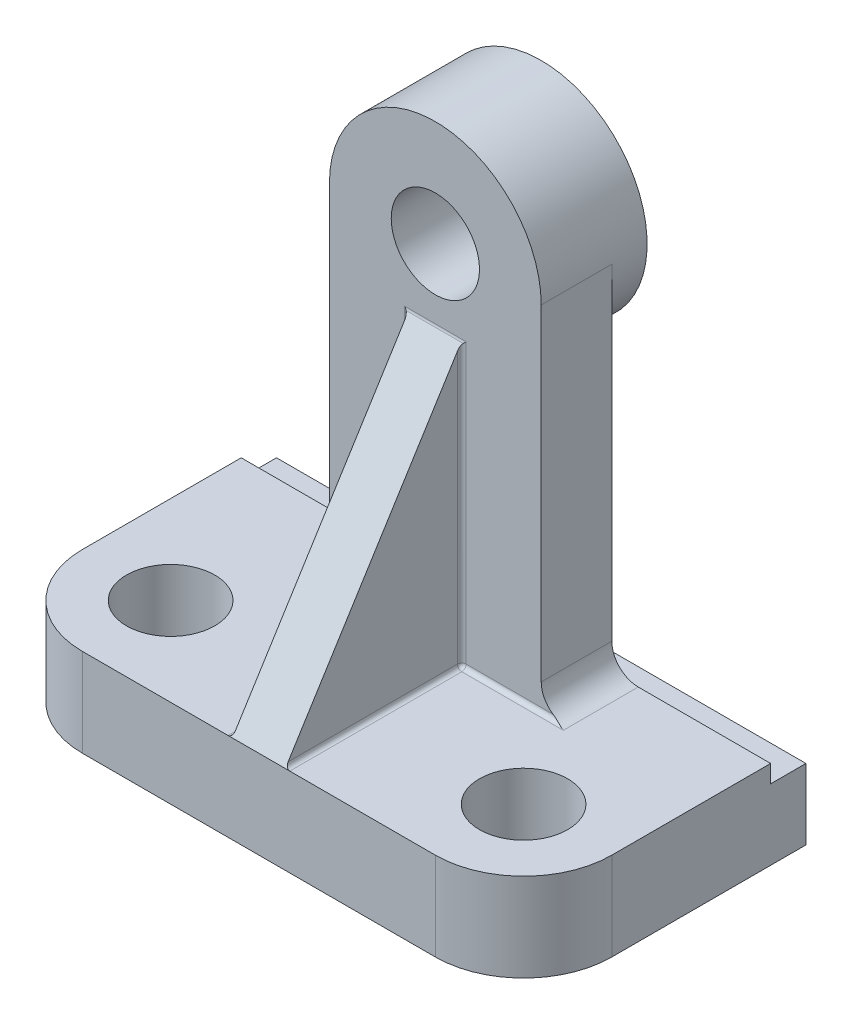
ISO-10303-21;
HEADER;
FILE_DESCRIPTION(('STEP AP214'),'2;1');
FILE_NAME('part.step','',(''),(''),'','','');
FILE_SCHEMA(('AUTOMOTIVE_DESIGN { 1 0 10303 214 1 1 1 1 }'));
ENDSEC;
DATA;
#1=APPLICATION_CONTEXT('core data for automotive mechanical design processes');
#2=APPLICATION_PROTOCOL_DEFINITION('international standard','automotive_design',2000,#1);
#3=PRODUCT_CONTEXT('',#1,'mechanical');
#4=PRODUCT('Part','Part','',(#3));
#5=PRODUCT_RELATED_PRODUCT_CATEGORY('part','',(#4));
#6=PRODUCT_DEFINITION_FORMATION('','',#4);
#7=PRODUCT_DEFINITION_CONTEXT('part definition',#1,'design');
#8=PRODUCT_DEFINITION('design','',#6,#7);
#9=PRODUCT_DEFINITION_SHAPE('','',#8);
#10=(LENGTH_UNIT() NAMED_UNIT(*) SI_UNIT(.MILLI.,.METRE.));
#11=(NAMED_UNIT(*) PLANE_ANGLE_UNIT() SI_UNIT($,.RADIAN.));
#12=(NAMED_UNIT(*) SI_UNIT($,.STERADIAN.) SOLID_ANGLE_UNIT());
#13=UNCERTAINTY_MEASURE_WITH_UNIT(LENGTH_MEASURE(1.E-05),#10,'distance_accuracy_value','');
#14=(GEOMETRIC_REPRESENTATION_CONTEXT(3) GLOBAL_UNCERTAINTY_ASSIGNED_CONTEXT((#13)) GLOBAL_UNIT_ASSIGNED_CONTEXT((#10,
#11,#12)) REPRESENTATION_CONTEXT('',''));
#15=CARTESIAN_POINT('',(0.,0.,0.));
#16=DIRECTION('',(0.,0.,1.));
#17=DIRECTION('',(1.,0.,0.));
#18=AXIS2_PLACEMENT_3D('',#15,#16,#17);
#19=CARTESIAN_POINT('',(-64.708154954579,20.,-20.));
#20=DIRECTION('',(0.,-1.,0.));
#21=DIRECTION('',(0.,0.,-1.));
#22=AXIS2_PLACEMENT_3D('',#19,#20,#21);
#23=PLANE('',#22);
#24=CARTESIAN_POINT('',(15.291845045421,20.,-20.));
#25=DIRECTION('',(0.,1.,0.));
#26=DIRECTION('',(0.,0.,1.));
#27=AXIS2_PLACEMENT_3D('',#24,#25,#26);
#28=CIRCLE('',#27,10.);
#29=CARTESIAN_POINT('',(15.291845045421,20.,-10.));
#30=VERTEX_POINT('',#29);
#31=EDGE_CURVE('E303',#30,#30,#28,.T.);
#32=ORIENTED_EDGE('',*,*,#31,.F.);
#33=EDGE_LOOP('',(#32));
#34=FACE_BOUND('',#33,.T.);
#35=DIRECTION('',(0.,0.,-1.));
#36=VECTOR('',#35,1.);
#37=CARTESIAN_POINT('',(5.29184504542103,20.,-40.));
#38=LINE('',#37,#36);
#39=CARTESIAN_POINT('',(5.29184504542103,20.,-39.));
#40=VERTEX_POINT('',#39);
#41=CARTESIAN_POINT('',(5.291845045421,20.,-56.));
#42=VERTEX_POINT('',#41);
#43=EDGE_CURVE('E263',#40,#42,#38,.T.);
#44=ORIENTED_EDGE('',*,*,#43,.F.);
#45=DIRECTION('',(-1.,0.,0.));
#46=VECTOR('',#45,1.);
#47=CARTESIAN_POINT('',(-64.708154954579,20.,-39.));
#48=LINE('',#47,#46);
#49=CARTESIAN_POINT('',(-17.708154954579,20.,-39.));
#50=VERTEX_POINT('',#49);
#51=EDGE_CURVE('E405',#40,#50,#48,.T.);
#52=ORIENTED_EDGE('',*,*,#51,.T.);
#53=DIRECTION('',(0.,0.,-1.));
#54=VECTOR('',#53,1.);
#55=CARTESIAN_POINT('',(-17.708154954579,20.,0.));
#56=LINE('',#55,#54);
#57=CARTESIAN_POINT('',(-17.7081549545789,20.,0.));
#58=VERTEX_POINT('',#57);
#59=EDGE_CURVE('E401',#50,#58,#56,.F.);
#60=ORIENTED_EDGE('',*,*,#59,.T.);
#61=DIRECTION('',(1.,0.,0.));
#62=VECTOR('',#61,1.);
#63=CARTESIAN_POINT('',(-64.708154954579,20.,0.));
#64=LINE('',#63,#62);
#65=CARTESIAN_POINT('',(15.291845045421,20.,0.));
#66=VERTEX_POINT('',#65);
#67=EDGE_CURVE('E323',#58,#66,#64,.T.);
#68=ORIENTED_EDGE('',*,*,#67,.T.);
#69=CARTESIAN_POINT('',(15.291845045421,20.,-20.));
#70=DIRECTION('',(0.,1.,0.));
#71=DIRECTION('',(0.,0.,1.));
#72=AXIS2_PLACEMENT_3D('',#69,#70,#71);
#73=CIRCLE('',#72,20.);
#74=CARTESIAN_POINT('',(35.291845045421,20.,-20.));
#75=VERTEX_POINT('',#74);
#76=EDGE_CURVE('E328',#66,#75,#73,.T.);
#77=ORIENTED_EDGE('',*,*,#76,.T.);
#78=DIRECTION('',(0.,0.,-1.));
#79=VECTOR('',#78,1.);
#80=CARTESIAN_POINT('',(35.291845045421,20.,-20.));
#81=LINE('',#80,#79);
#82=CARTESIAN_POINT('',(35.291845045421,20.,-56.));
#83=VERTEX_POINT('',#82);
#84=EDGE_CURVE('E331',#75,#83,#81,.T.);
#85=ORIENTED_EDGE('',*,*,#84,.T.);
#86=DIRECTION('',(1.,0.,0.));
#87=VECTOR('',#86,1.);
#88=CARTESIAN_POINT('',(-84.708154954579,20.,-56.));
#89=LINE('',#88,#87);
#90=EDGE_CURVE('E267',#42,#83,#89,.T.);
#91=ORIENTED_EDGE('',*,*,#90,.F.);
#92=EDGE_LOOP('',(#44,#52,#60,#68,#77,#85,#91));
#93=FACE_BOUND('',#92,.T.);
#94=ADVANCED_FACE('F43',(#34,#93),#23,.F.);
#95=CARTESIAN_POINT('',(-84.708154954579,16.,-56.));
#96=DIRECTION('',(0.,0.,1.));
#97=DIRECTION('',(1.,0.,0.));
#98=AXIS2_PLACEMENT_3D('',#95,#96,#97);
#99=PLANE('',#98);
#100=DIRECTION('',(0.,1.,0.));
#101=VECTOR('',#100,1.);
#102=CARTESIAN_POINT('',(-48.708154954579,26.,-56.));
#103=LINE('',#102,#101);
#104=CARTESIAN_POINT('',(-48.708154954579,26.,-56.));
#105=VERTEX_POINT('',#104);
#106=CARTESIAN_POINT('',(-48.708154954579,100.,-56.));
#107=VERTEX_POINT('',#106);
#108=EDGE_CURVE('E208',#105,#107,#103,.T.);
#109=ORIENTED_EDGE('',*,*,#108,.T.);
#110=CARTESIAN_POINT('',(-24.708154954579,100.,-56.));
#111=DIRECTION('',(0.,0.,-1.));
#112=DIRECTION('',(-1.,0.,0.));
#113=AXIS2_PLACEMENT_3D('',#110,#111,#112);
#114=CIRCLE('',#113,24.);
#115=CARTESIAN_POINT('',(-0.708154954578957,100.,-56.));
#116=VERTEX_POINT('',#115);
#117=EDGE_CURVE('E213',#116,#107,#114,.T.);
#118=ORIENTED_EDGE('',*,*,#117,.F.);
#119=DIRECTION('',(0.,-1.,0.));
#120=VECTOR('',#119,1.);
#121=CARTESIAN_POINT('',(-0.70815495457896,100.,-56.));
#122=LINE('',#121,#120);
#123=CARTESIAN_POINT('',(-0.70815495457897,26.,-56.));
#124=VERTEX_POINT('',#123);
#125=EDGE_CURVE('E196',#116,#124,#122,.T.);
#126=ORIENTED_EDGE('',*,*,#125,.T.);
#127=CARTESIAN_POINT('',(5.29184504542103,26.,-56.));
#128=DIRECTION('',(0.,0.,1.));
#129=DIRECTION('',(1.,0.,0.));
#130=AXIS2_PLACEMENT_3D('',#127,#128,#129);
#131=CIRCLE('',#130,6.);
#132=EDGE_CURVE('E207',#124,#42,#131,.T.);
#133=ORIENTED_EDGE('',*,*,#132,.T.);
#134=ORIENTED_EDGE('',*,*,#90,.T.);
#135=DIRECTION('',(0.,1.,0.));
#136=VECTOR('',#135,1.);
#137=CARTESIAN_POINT('',(35.291845045421,16.,-56.));
#138=LINE('',#137,#136);
#139=CARTESIAN_POINT('',(35.291845045421,16.,-56.));
#140=VERTEX_POINT('',#139);
#141=EDGE_CURVE('E296',#140,#83,#138,.T.);
#142=ORIENTED_EDGE('',*,*,#141,.F.);
#143=DIRECTION('',(1.,0.,0.));
#144=VECTOR('',#143,1.);
#145=CARTESIAN_POINT('',(-84.708154954579,16.,-56.));
#146=LINE('',#145,#144);
#147=CARTESIAN_POINT('',(-84.708154954579,16.,-56.));
#148=VERTEX_POINT('',#147);
#149=EDGE_CURVE('E282',#148,#140,#146,.T.);
#150=ORIENTED_EDGE('',*,*,#149,.F.);
#151=DIRECTION('',(0.,1.,0.));
#152=VECTOR('',#151,1.);
#153=CARTESIAN_POINT('',(-84.708154954579,16.,-56.));
#154=LINE('',#153,#152);
#155=CARTESIAN_POINT('',(-84.708154954579,20.,-56.));
#156=VERTEX_POINT('',#155);
#157=EDGE_CURVE('E292',#148,#156,#154,.T.);
#158=ORIENTED_EDGE('',*,*,#157,.T.);
#159=CARTESIAN_POINT('',(-54.708154954579,20.,-56.));
#160=VERTEX_POINT('',#159);
#161=EDGE_CURVE('E283',#156,#160,#89,.T.);
#162=ORIENTED_EDGE('',*,*,#161,.T.);
#163=CARTESIAN_POINT('',(-54.708154954579,26.,-56.));
#164=DIRECTION('',(0.,0.,1.));
#165=DIRECTION('',(1.,0.,0.));
#166=AXIS2_PLACEMENT_3D('',#163,#164,#165);
#167=CIRCLE('',#166,6.);
#168=EDGE_CURVE('E239',#160,#105,#167,.T.);
#169=ORIENTED_EDGE('',*,*,#168,.T.);
#170=EDGE_LOOP('',(#109,#118,#126,#133,#134,#142,#150,#158,#162,#169));
#171=FACE_BOUND('',#170,.T.);
#172=ADVANCED_FACE('F221',(#171),#99,.F.);
#173=CARTESIAN_POINT('',(-84.708154954579,20.,-64.));
#174=DIRECTION('',(0.,0.,1.));
#175=DIRECTION('',(1.,0.,0.));
#176=AXIS2_PLACEMENT_3D('',#173,#174,#175);
#177=PLANE('',#176);
#178=DIRECTION('',(0.,-1.,0.));
#179=VECTOR('',#178,1.);
#180=CARTESIAN_POINT('',(-84.708154954579,20.,-64.));
#181=LINE('',#180,#179);
#182=CARTESIAN_POINT('',(-84.708154954579,16.,-64.));
#183=VERTEX_POINT('',#182);
#184=CARTESIAN_POINT('',(-84.708154954579,0.,-64.));
#185=VERTEX_POINT('',#184);
#186=EDGE_CURVE('E360',#183,#185,#181,.T.);
#187=ORIENTED_EDGE('',*,*,#186,.F.);
#188=DIRECTION('',(-1.,0.,0.));
#189=VECTOR('',#188,1.);
#190=CARTESIAN_POINT('',(-84.708154954579,16.,-64.));
#191=LINE('',#190,#189);
#192=CARTESIAN_POINT('',(35.291845045421,16.,-64.));
#193=VERTEX_POINT('',#192);
#194=EDGE_CURVE('E289',#193,#183,#191,.T.);
#195=ORIENTED_EDGE('',*,*,#194,.F.);
#196=DIRECTION('',(0.,-1.,0.));
#197=VECTOR('',#196,1.);
#198=CARTESIAN_POINT('',(35.291845045421,20.,-64.));
#199=LINE('',#198,#197);
#200=CARTESIAN_POINT('',(35.291845045421,0.,-64.));
#201=VERTEX_POINT('',#200);
#202=EDGE_CURVE('E364',#193,#201,#199,.T.);
#203=ORIENTED_EDGE('',*,*,#202,.T.);
#204=DIRECTION('',(-1.,0.,0.));
#205=VECTOR('',#204,1.);
#206=CARTESIAN_POINT('',(-84.708154954579,0.,-64.));
#207=LINE('',#206,#205);
#208=EDGE_CURVE('E352',#201,#185,#207,.T.);
#209=ORIENTED_EDGE('',*,*,#208,.T.);
#210=EDGE_LOOP('',(#187,#195,#203,#209));
#211=FACE_BOUND('',#210,.T.);
#212=ADVANCED_FACE('F490',(#211),#177,.F.);
#213=DIRECTION('',(-1.,0.,0.));
#214=VECTOR('',#213,1.);
#215=CARTESIAN_POINT('',(-64.708154954579,20.,-39.));
#216=LINE('',#215,#214);
#217=CARTESIAN_POINT('',(-31.708154954579,20.,-39.));
#218=VERTEX_POINT('',#217);
#219=CARTESIAN_POINT('',(-54.708154954579,20.,-39.));
#220=VERTEX_POINT('',#219);
#221=EDGE_CURVE('E382',#218,#220,#216,.T.);
#222=ORIENTED_EDGE('',*,*,#221,.T.);
#223=DIRECTION('',(0.,0.,-1.));
#224=VECTOR('',#223,1.);
#225=CARTESIAN_POINT('',(-54.708154954579,20.,-40.));
#226=LINE('',#225,#224);
#227=EDGE_CURVE('E256',#220,#160,#226,.T.);
#228=ORIENTED_EDGE('',*,*,#227,.T.);
#229=ORIENTED_EDGE('',*,*,#161,.F.);
#230=DIRECTION('',(0.,0.,1.));
#231=VECTOR('',#230,1.);
#232=CARTESIAN_POINT('',(-84.708154954579,20.,-20.0000000000001));
#233=LINE('',#232,#231);
#234=CARTESIAN_POINT('',(-84.708154954579,20.,-20.0000000000001));
#235=VERTEX_POINT('',#234);
#236=EDGE_CURVE('E335',#156,#235,#233,.T.);
#237=ORIENTED_EDGE('',*,*,#236,.T.);
#238=CARTESIAN_POINT('',(-64.708154954579,20.,-20.));
#239=DIRECTION('',(0.,1.,0.));
#240=DIRECTION('',(0.,0.,-1.));
#241=AXIS2_PLACEMENT_3D('',#238,#239,#240);
#242=CIRCLE('',#241,20.);
#243=CARTESIAN_POINT('',(-64.708154954579,20.,0.));
#244=VERTEX_POINT('',#243);
#245=EDGE_CURVE('E319',#235,#244,#242,.T.);
#246=ORIENTED_EDGE('',*,*,#245,.T.);
#247=CARTESIAN_POINT('',(-31.708154954579,20.,0.));
#248=VERTEX_POINT('',#247);
#249=EDGE_CURVE('E325',#244,#248,#64,.T.);
#250=ORIENTED_EDGE('',*,*,#249,.T.);
#251=DIRECTION('',(0.,0.,-1.));
#252=VECTOR('',#251,1.);
#253=CARTESIAN_POINT('',(-31.708154954579,20.,-20.));
#254=LINE('',#253,#252);
#255=EDGE_CURVE('E379',#248,#218,#254,.T.);
#256=ORIENTED_EDGE('',*,*,#255,.T.);
#257=EDGE_LOOP('',(#222,#228,#229,#237,#246,#250,#256));
#258=FACE_BOUND('',#257,.T.);
#259=CARTESIAN_POINT('',(-64.708154954579,20.,-20.));
#260=DIRECTION('',(0.,1.,0.));
#261=DIRECTION('',(0.,0.,1.));
#262=AXIS2_PLACEMENT_3D('',#259,#260,#261);
#263=CIRCLE('',#262,10.);
#264=CARTESIAN_POINT('',(-64.708154954579,20.,-10.));
#265=VERTEX_POINT('',#264);
#266=EDGE_CURVE('E311',#265,#265,#263,.T.);
#267=ORIENTED_EDGE('',*,*,#266,.F.);
#268=EDGE_LOOP('',(#267));
#269=FACE_BOUND('',#268,.T.);
#270=ADVANCED_FACE('F486',(#258,#269),#23,.F.);
#271=CARTESIAN_POINT('',(-64.708154954579,0.,-20.));
#272=DIRECTION('',(0.,-1.,0.));
#273=DIRECTION('',(0.,0.,-1.));
#274=AXIS2_PLACEMENT_3D('',#271,#272,#273);
#275=PLANE('',#274);
#276=DIRECTION('',(0.,0.,1.));
#277=VECTOR('',#276,1.);
#278=CARTESIAN_POINT('',(-84.708154954579,0.,-20.0000000000001));
#279=LINE('',#278,#277);
#280=CARTESIAN_POINT('',(-84.708154954579,0.,-20.0000000000001));
#281=VERTEX_POINT('',#280);
#282=EDGE_CURVE('E324',#185,#281,#279,.T.);
#283=ORIENTED_EDGE('',*,*,#282,.F.);
#284=ORIENTED_EDGE('',*,*,#208,.F.);
#285=DIRECTION('',(0.,0.,-1.));
#286=VECTOR('',#285,1.);
#287=CARTESIAN_POINT('',(35.291845045421,0.,-20.));
#288=LINE('',#287,#286);
#289=CARTESIAN_POINT('',(35.291845045421,0.,-20.));
#290=VERTEX_POINT('',#289);
#291=EDGE_CURVE('E348',#290,#201,#288,.T.);
#292=ORIENTED_EDGE('',*,*,#291,.F.);
#293=CARTESIAN_POINT('',(15.291845045421,0.,-20.));
#294=DIRECTION('',(0.,1.,0.));
#295=DIRECTION('',(0.,0.,1.));
#296=AXIS2_PLACEMENT_3D('',#293,#294,#295);
#297=CIRCLE('',#296,20.);
#298=CARTESIAN_POINT('',(15.291845045421,0.,0.));
#299=VERTEX_POINT('',#298);
#300=EDGE_CURVE('E345',#299,#290,#297,.T.);
#301=ORIENTED_EDGE('',*,*,#300,.F.);
#302=DIRECTION('',(1.,0.,0.));
#303=VECTOR('',#302,1.);
#304=CARTESIAN_POINT('',(-64.708154954579,0.,0.));
#305=LINE('',#304,#303);
#306=CARTESIAN_POINT('',(-64.708154954579,0.,0.));
#307=VERTEX_POINT('',#306);
#308=EDGE_CURVE('E342',#307,#299,#305,.T.);
#309=ORIENTED_EDGE('',*,*,#308,.F.);
#310=CARTESIAN_POINT('',(-64.708154954579,0.,-20.));
#311=DIRECTION('',(0.,1.,0.));
#312=DIRECTION('',(0.,0.,-1.));
#313=AXIS2_PLACEMENT_3D('',#310,#311,#312);
#314=CIRCLE('',#313,20.);
#315=EDGE_CURVE('E315',#281,#307,#314,.T.);
#316=ORIENTED_EDGE('',*,*,#315,.F.);
#317=EDGE_LOOP('',(#283,#284,#292,#301,#309,#316));
#318=FACE_BOUND('',#317,.T.);
#319=CARTESIAN_POINT('',(-64.708154954579,0.,-20.));
#320=DIRECTION('',(0.,1.,0.));
#321=DIRECTION('',(0.,0.,1.));
#322=AXIS2_PLACEMENT_3D('',#319,#320,#321);
#323=CIRCLE('',#322,10.);
#324=CARTESIAN_POINT('',(-64.708154954579,0.,-10.));
#325=VERTEX_POINT('',#324);
#326=EDGE_CURVE('E307',#325,#325,#323,.T.);
#327=ORIENTED_EDGE('',*,*,#326,.T.);
#328=EDGE_LOOP('',(#327));
#329=FACE_BOUND('',#328,.T.);
#330=CARTESIAN_POINT('',(15.291845045421,0.,-20.));
#331=DIRECTION('',(0.,1.,0.));
#332=DIRECTION('',(0.,0.,1.));
#333=AXIS2_PLACEMENT_3D('',#330,#331,#332);
#334=CIRCLE('',#333,10.);
#335=CARTESIAN_POINT('',(15.291845045421,0.,-10.));
#336=VERTEX_POINT('',#335);
#337=EDGE_CURVE('E300',#336,#336,#334,.T.);
#338=ORIENTED_EDGE('',*,*,#337,.T.);
#339=EDGE_LOOP('',(#338));
#340=FACE_BOUND('',#339,.T.);
#341=ADVANCED_FACE('F497',(#318,#329,#340),#275,.T.);
#342=CARTESIAN_POINT('',(-64.708154954579,20.,-20.));
#343=DIRECTION('',(0.,-1.,0.));
#344=DIRECTION('',(0.,0.,-1.));
#345=AXIS2_PLACEMENT_3D('',#342,#343,#344);
#346=CYLINDRICAL_SURFACE('',#345,20.);
#347=ORIENTED_EDGE('',*,*,#315,.T.);
#348=DIRECTION('',(0.,-1.,0.));
#349=VECTOR('',#348,1.);
#350=CARTESIAN_POINT('',(-64.708154954579,20.,0.));
#351=LINE('',#350,#349);
#352=EDGE_CURVE('E375',#244,#307,#351,.T.);
#353=ORIENTED_EDGE('',*,*,#352,.F.);
#354=ORIENTED_EDGE('',*,*,#245,.F.);
#355=DIRECTION('',(0.,-1.,0.));
#356=VECTOR('',#355,1.);
#357=CARTESIAN_POINT('',(-84.708154954579,20.,-20.0000000000001));
#358=LINE('',#357,#356);
#359=EDGE_CURVE('E338',#235,#281,#358,.T.);
#360=ORIENTED_EDGE('',*,*,#359,.T.);
#361=EDGE_LOOP('',(#347,#353,#354,#360));
#362=FACE_BOUND('',#361,.T.);
#363=ADVANCED_FACE('F450',(#362),#346,.T.);
#364=CARTESIAN_POINT('',(-64.708154954579,20.,0.));
#365=DIRECTION('',(0.,0.,-1.));
#366=DIRECTION('',(-1.,0.,0.));
#367=AXIS2_PLACEMENT_3D('',#364,#365,#366);
#368=PLANE('',#367);
#369=ORIENTED_EDGE('',*,*,#308,.T.);
#370=DIRECTION('',(0.,-1.,0.));
#371=VECTOR('',#370,1.);
#372=CARTESIAN_POINT('',(15.291845045421,20.,0.));
#373=LINE('',#372,#371);
#374=EDGE_CURVE('E371',#66,#299,#373,.T.);
#375=ORIENTED_EDGE('',*,*,#374,.F.);
#376=ORIENTED_EDGE('',*,*,#67,.F.);
#377=DIRECTION('',(1.,0.,0.));
#378=VECTOR('',#377,1.);
#379=CARTESIAN_POINT('',(-64.708154954579,20.,0.));
#380=LINE('',#379,#378);
#381=EDGE_CURVE('E63',#248,#58,#380,.T.);
#382=ORIENTED_EDGE('',*,*,#381,.F.);
#383=ORIENTED_EDGE('',*,*,#249,.F.);
#384=ORIENTED_EDGE('',*,*,#352,.T.);
#385=EDGE_LOOP('',(#369,#375,#376,#382,#383,#384));
#386=FACE_BOUND('',#385,.T.);
#387=ADVANCED_FACE('F622',(#386),#368,.F.);
#388=CARTESIAN_POINT('',(15.291845045421,20.,-20.));
#389=DIRECTION('',(0.,-1.,0.));
#390=DIRECTION('',(0.,0.,-1.));
#391=AXIS2_PLACEMENT_3D('',#388,#389,#390);
#392=CYLINDRICAL_SURFACE('',#391,20.);
#393=ORIENTED_EDGE('',*,*,#300,.T.);
#394=DIRECTION('',(0.,-1.,0.));
#395=VECTOR('',#394,1.);
#396=CARTESIAN_POINT('',(35.291845045421,20.,-20.));
#397=LINE('',#396,#395);
#398=EDGE_CURVE('E367',#75,#290,#397,.T.);
#399=ORIENTED_EDGE('',*,*,#398,.F.);
#400=ORIENTED_EDGE('',*,*,#76,.F.);
#401=ORIENTED_EDGE('',*,*,#374,.T.);
#402=EDGE_LOOP('',(#393,#399,#400,#401));
#403=FACE_BOUND('',#402,.T.);
#404=ADVANCED_FACE('F874',(#403),#392,.T.);
#405=CARTESIAN_POINT('',(35.291845045421,20.,-20.));
#406=DIRECTION('',(-1.,0.,0.));
#407=DIRECTION('',(0.,0.,1.));
#408=AXIS2_PLACEMENT_3D('',#405,#406,#407);
#409=PLANE('',#408);
#410=DIRECTION('',(0.,0.,-1.));
#411=VECTOR('',#410,1.);
#412=CARTESIAN_POINT('',(35.291845045421,16.,-64.));
#413=LINE('',#412,#411);
#414=EDGE_CURVE('E286',#140,#193,#413,.T.);
#415=ORIENTED_EDGE('',*,*,#414,.F.);
#416=ORIENTED_EDGE('',*,*,#141,.T.);
#417=ORIENTED_EDGE('',*,*,#84,.F.);
#418=ORIENTED_EDGE('',*,*,#398,.T.);
#419=ORIENTED_EDGE('',*,*,#291,.T.);
#420=ORIENTED_EDGE('',*,*,#202,.F.);
#421=EDGE_LOOP('',(#415,#416,#417,#418,#419,#420));
#422=FACE_BOUND('',#421,.T.);
#423=ADVANCED_FACE('F542',(#422),#409,.F.);
#424=CARTESIAN_POINT('',(-84.708154954579,20.,-20.0000000000001));
#425=DIRECTION('',(1.,0.,0.));
#426=DIRECTION('',(0.,0.,-1.));
#427=AXIS2_PLACEMENT_3D('',#424,#425,#426);
#428=PLANE('',#427);
#429=ORIENTED_EDGE('',*,*,#236,.F.);
#430=ORIENTED_EDGE('',*,*,#157,.F.);
#431=DIRECTION('',(0.,0.,1.));
#432=VECTOR('',#431,1.);
#433=CARTESIAN_POINT('',(-84.708154954579,16.,-64.));
#434=LINE('',#433,#432);
#435=EDGE_CURVE('E278',#183,#148,#434,.T.);
#436=ORIENTED_EDGE('',*,*,#435,.F.);
#437=ORIENTED_EDGE('',*,*,#186,.T.);
#438=ORIENTED_EDGE('',*,*,#282,.T.);
#439=ORIENTED_EDGE('',*,*,#359,.F.);
#440=EDGE_LOOP('',(#429,#430,#436,#437,#438,#439));
#441=FACE_BOUND('',#440,.T.);
#442=ADVANCED_FACE('F514',(#441),#428,.F.);
#443=CARTESIAN_POINT('',(-64.708154954579,20.,-20.));
#444=DIRECTION('',(0.,-1.,0.));
#445=DIRECTION('',(0.,0.,-1.));
#446=AXIS2_PLACEMENT_3D('',#443,#444,#445);
#447=CYLINDRICAL_SURFACE('',#446,10.);
#448=ORIENTED_EDGE('',*,*,#266,.T.);
#449=EDGE_LOOP('',(#448));
#450=FACE_BOUND('',#449,.T.);
#451=ORIENTED_EDGE('',*,*,#326,.F.);
#452=EDGE_LOOP('',(#451));
#453=FACE_BOUND('',#452,.T.);
#454=ADVANCED_FACE('F510',(#450,#453),#447,.F.);
#455=CARTESIAN_POINT('',(15.291845045421,20.,-20.));
#456=DIRECTION('',(0.,-1.,0.));
#457=DIRECTION('',(0.,0.,-1.));
#458=AXIS2_PLACEMENT_3D('',#455,#456,#457);
#459=CYLINDRICAL_SURFACE('',#458,10.);
#460=ORIENTED_EDGE('',*,*,#31,.T.);
#461=EDGE_LOOP('',(#460));
#462=FACE_BOUND('',#461,.T.);
#463=ORIENTED_EDGE('',*,*,#337,.F.);
#464=EDGE_LOOP('',(#463));
#465=FACE_BOUND('',#464,.T.);
#466=ADVANCED_FACE('F513',(#462,#465),#459,.F.);
#467=CARTESIAN_POINT('',(0.,16.,0.));
#468=DIRECTION('',(0.,1.,0.));
#469=DIRECTION('',(0.,0.,1.));
#470=AXIS2_PLACEMENT_3D('',#467,#468,#469);
#471=PLANE('',#470);
#472=ORIENTED_EDGE('',*,*,#149,.T.);
#473=ORIENTED_EDGE('',*,*,#414,.T.);
#474=ORIENTED_EDGE('',*,*,#194,.T.);
#475=ORIENTED_EDGE('',*,*,#435,.T.);
#476=EDGE_LOOP('',(#472,#473,#474,#475));
#477=FACE_BOUND('',#476,.T.);
#478=ADVANCED_FACE('F521',(#477),#471,.T.);
#479=CARTESIAN_POINT('',(5.29184504542103,26.,-40.));
#480=DIRECTION('',(0.,0.,-1.));
#481=DIRECTION('',(-1.,0.,0.));
#482=AXIS2_PLACEMENT_3D('',#479,#480,#481);
#483=CYLINDRICAL_SURFACE('',#482,6.);
#484=ORIENTED_EDGE('',*,*,#132,.F.);
#485=DIRECTION('',(0.,0.,-1.));
#486=VECTOR('',#485,1.);
#487=CARTESIAN_POINT('',(-0.70815495457897,26.,-40.));
#488=LINE('',#487,#486);
#489=CARTESIAN_POINT('',(-0.70815495457897,26.,-40.));
#490=VERTEX_POINT('',#489);
#491=EDGE_CURVE('E202',#490,#124,#488,.T.);
#492=ORIENTED_EDGE('',*,*,#491,.F.);
#493=CARTESIAN_POINT('',(5.29184504542103,26.,-40.));
#494=DIRECTION('',(0.,0.,1.));
#495=DIRECTION('',(1.,0.,0.));
#496=AXIS2_PLACEMENT_3D('',#493,#494,#495);
#497=CIRCLE('',#496,6.);
#498=CARTESIAN_POINT('',(1.97522025506564,21.,-40.));
#499=VERTEX_POINT('',#498);
#500=EDGE_CURVE('E252',#490,#499,#497,.T.);
#501=ORIENTED_EDGE('',*,*,#500,.T.);
#502=CARTESIAN_POINT('',(1.97522025506564,21.,-40.));
#503=CARTESIAN_POINT('',(2.04595579507455,20.9530692628139,-39.999960889859));
#504=CARTESIAN_POINT('',(2.11763433057041,20.9076944713355,-39.9967001292477));
#505=CARTESIAN_POINT('',(2.26240212421996,20.8202715688812,-39.9847128710553));
#506=CARTESIAN_POINT('',(2.33548895884603,20.7782182846166,-39.9759950697934));
#507=CARTESIAN_POINT('',(2.48243694010388,20.6977158008875,-39.9541228058013));
#508=CARTESIAN_POINT('',(2.55629197464505,20.6592487724963,-39.940991971183));
#509=CARTESIAN_POINT('',(2.70495345474136,20.5856788043009,-39.9109976720676));
#510=CARTESIAN_POINT('',(2.77976042209126,20.5505778082295,-39.8941320692889));
#511=CARTESIAN_POINT('',(2.99078085339373,20.4567882720513,-39.8424252200398));
#512=CARTESIAN_POINT('',(3.12784316420478,20.4019175146588,-39.8040595026935));
#513=CARTESIAN_POINT('',(3.40360942857672,20.3029786219461,-39.7199831439616));
#514=CARTESIAN_POINT('',(3.54231424209158,20.2589164338242,-39.6742684817623));
#515=CARTESIAN_POINT('',(3.82127238940353,20.1811988817157,-39.5774342802611));
#516=CARTESIAN_POINT('',(3.96152931317533,20.1475781776246,-39.5262974802128));
#517=CARTESIAN_POINT('',(4.24270498292374,20.0906961784226,-39.4204457568417));
#518=CARTESIAN_POINT('',(4.38362342655457,20.0674305430729,-39.3657323436749));
#519=CARTESIAN_POINT('',(4.65008886876781,20.0330811465728,-39.2603565807877));
#520=CARTESIAN_POINT('',(4.77559213257536,20.0209258704582,-39.2099256489211));
#521=CARTESIAN_POINT('',(5.02657329581897,20.0045503704676,-39.1082817271839));
#522=CARTESIAN_POINT('',(5.15205089042001,20.0003169856652,-39.0570701771716));
#523=CARTESIAN_POINT('',(5.28228325194696,20.0000057158814,-39.0039035853255));
#524=CARTESIAN_POINT('',(5.28706417095817,20.0000000018403,-39.0019517831563));
#525=CARTESIAN_POINT('',(5.29184504542103,20.,-39.));
#526=B_SPLINE_CURVE_WITH_KNOTS('',3,(#502,#503,#504,#505,#506,#507,#508,#509,#510,#511,#512,
#513,#514,#515,#516,#517,#518,#519,#520,#521,#522,#523,#524,#525),.UNSPECIFIED.,.F.,.F.,(4,2,2,
2,2,2,2,2,2,2,2,4),(0.,0.254478765589331,0.508553023606619,0.761288041690675,1.01416813500991,
1.47107229962254,1.92822730548707,2.38688397976833,2.84534823055554,3.25253093781937,
3.65903657498634,3.6745285178593),.UNSPECIFIED.);
#527=EDGE_CURVE('E432',#499,#40,#526,.T.);
#528=ORIENTED_EDGE('',*,*,#527,.T.);
#529=ORIENTED_EDGE('',*,*,#43,.T.);
#530=EDGE_LOOP('',(#484,#492,#501,#528,#529));
#531=FACE_BOUND('',#530,.T.);
#532=ADVANCED_FACE('F527',(#531),#483,.F.);
#533=CARTESIAN_POINT('',(-0.70815495457896,100.,-40.));
#534=DIRECTION('',(1.,0.,0.));
#535=DIRECTION('',(0.,1.,0.));
#536=AXIS2_PLACEMENT_3D('',#533,#534,#535);
#537=PLANE('',#536);
#538=ORIENTED_EDGE('',*,*,#125,.F.);
#539=DIRECTION('',(0.,0.,-1.));
#540=VECTOR('',#539,1.);
#541=CARTESIAN_POINT('',(-0.70815495457896,100.,-40.));
#542=LINE('',#541,#540);
#543=CARTESIAN_POINT('',(-0.70815495457896,100.,-40.));
#544=VERTEX_POINT('',#543);
#545=EDGE_CURVE('E200',#544,#116,#542,.T.);
#546=ORIENTED_EDGE('',*,*,#545,.F.);
#547=DIRECTION('',(0.,-1.,0.));
#548=VECTOR('',#547,1.);
#549=CARTESIAN_POINT('',(-0.70815495457896,100.,-40.));
#550=LINE('',#549,#548);
#551=EDGE_CURVE('E249',#544,#490,#550,.T.);
#552=ORIENTED_EDGE('',*,*,#551,.T.);
#553=ORIENTED_EDGE('',*,*,#491,.T.);
#554=EDGE_LOOP('',(#538,#546,#552,#553));
#555=FACE_BOUND('',#554,.T.);
#556=ADVANCED_FACE('F198',(#555),#537,.T.);
#557=CARTESIAN_POINT('',(-24.708154954579,100.,-40.));
#558=DIRECTION('',(0.,0.,-1.));
#559=DIRECTION('',(-1.,0.,0.));
#560=AXIS2_PLACEMENT_3D('',#557,#558,#559);
#561=CYLINDRICAL_SURFACE('',#560,24.);
#562=CARTESIAN_POINT('',(-24.708154954579,100.,-64.));
#563=DIRECTION('',(0.,0.,-1.));
#564=DIRECTION('',(-1.,0.,0.));
#565=AXIS2_PLACEMENT_3D('',#562,#563,#564);
#566=CIRCLE('',#565,24.);
#567=CARTESIAN_POINT('',(-48.708154954579,100.,-64.));
#568=VERTEX_POINT('',#567);
#569=EDGE_CURVE('E225',#568,#568,#566,.T.);
#570=ORIENTED_EDGE('',*,*,#569,.F.);
#571=EDGE_LOOP('',(#570));
#572=FACE_BOUND('',#571,.T.);
#573=ORIENTED_EDGE('',*,*,#117,.T.);
#574=DIRECTION('',(0.,0.,-1.));
#575=VECTOR('',#574,1.);
#576=CARTESIAN_POINT('',(-48.708154954579,100.,-40.));
#577=LINE('',#576,#575);
#578=CARTESIAN_POINT('',(-48.708154954579,100.,-40.));
#579=VERTEX_POINT('',#578);
#580=EDGE_CURVE('E218',#579,#107,#577,.T.);
#581=ORIENTED_EDGE('',*,*,#580,.F.);
#582=CARTESIAN_POINT('',(-24.708154954579,100.,-40.));
#583=DIRECTION('',(0.,0.,-1.));
#584=DIRECTION('',(-1.,0.,0.));
#585=AXIS2_PLACEMENT_3D('',#582,#583,#584);
#586=CIRCLE('',#585,24.);
#587=EDGE_CURVE('E216',#579,#544,#586,.T.);
#588=ORIENTED_EDGE('',*,*,#587,.T.);
#589=ORIENTED_EDGE('',*,*,#545,.T.);
#590=EDGE_LOOP('',(#573,#581,#588,#589));
#591=FACE_BOUND('',#590,.T.);
#592=ADVANCED_FACE('F212',(#572,#591),#561,.T.);
#593=CARTESIAN_POINT('',(-48.708154954579,26.,-40.));
#594=DIRECTION('',(-1.,0.,0.));
#595=DIRECTION('',(0.,0.,1.));
#596=AXIS2_PLACEMENT_3D('',#593,#594,#595);
#597=PLANE('',#596);
#598=ORIENTED_EDGE('',*,*,#108,.F.);
#599=DIRECTION('',(0.,0.,-1.));
#600=VECTOR('',#599,1.);
#601=CARTESIAN_POINT('',(-48.708154954579,26.,-40.));
#602=LINE('',#601,#600);
#603=CARTESIAN_POINT('',(-48.708154954579,26.,-40.));
#604=VERTEX_POINT('',#603);
#605=EDGE_CURVE('E272',#604,#105,#602,.T.);
#606=ORIENTED_EDGE('',*,*,#605,.F.);
#607=DIRECTION('',(0.,1.,0.));
#608=VECTOR('',#607,1.);
#609=CARTESIAN_POINT('',(-48.708154954579,26.,-40.));
#610=LINE('',#609,#608);
#611=EDGE_CURVE('E243',#604,#579,#610,.T.);
#612=ORIENTED_EDGE('',*,*,#611,.T.);
#613=ORIENTED_EDGE('',*,*,#580,.T.);
#614=EDGE_LOOP('',(#598,#606,#612,#613));
#615=FACE_BOUND('',#614,.T.);
#616=ADVANCED_FACE('F666',(#615),#597,.T.);
#617=CARTESIAN_POINT('',(-54.708154954579,26.,-40.));
#618=DIRECTION('',(0.,0.,-1.));
#619=DIRECTION('',(-1.,0.,0.));
#620=AXIS2_PLACEMENT_3D('',#617,#618,#619);
#621=CYLINDRICAL_SURFACE('',#620,6.);
#622=ORIENTED_EDGE('',*,*,#168,.F.);
#623=ORIENTED_EDGE('',*,*,#227,.F.);
#624=CARTESIAN_POINT('',(-51.3915301642236,21.,-40.));
#625=CARTESIAN_POINT('',(-51.4622657042326,20.9530692628138,-39.999960889859));
#626=CARTESIAN_POINT('',(-51.5339442397287,20.9076944713354,-39.9967001292477));
#627=CARTESIAN_POINT('',(-51.6787120333785,20.8202715688808,-39.9847128710552));
#628=CARTESIAN_POINT('',(-51.7517988680048,20.7782182846162,-39.9759950697933));
#629=CARTESIAN_POINT('',(-51.8987468492627,20.6977158008871,-39.9541228058011));
#630=CARTESIAN_POINT('',(-51.9726018838037,20.659248772496,-39.9409919711828));
#631=CARTESIAN_POINT('',(-52.1212633638997,20.5856788043008,-39.9109976720675));
#632=CARTESIAN_POINT('',(-52.1960703312494,20.5505778082294,-39.8941320692888));
#633=CARTESIAN_POINT('',(-52.4070907625516,20.4567882720514,-39.8424252200399));
#634=CARTESIAN_POINT('',(-52.5441530733625,20.4019175146589,-39.8040595026935));
#635=CARTESIAN_POINT('',(-52.8199193377342,20.3029786219463,-39.7199831439618));
#636=CARTESIAN_POINT('',(-52.958624151249,20.2589164338243,-39.6742684817626));
#637=CARTESIAN_POINT('',(-53.2375822985609,20.1811988817159,-39.5774342802612));
#638=CARTESIAN_POINT('',(-53.3778392223327,20.1475781776246,-39.5262974802126));
#639=CARTESIAN_POINT('',(-53.6590148920817,20.0906961784226,-39.4204457568421));
#640=CARTESIAN_POINT('',(-53.799933335713,20.0674305430729,-39.3657323436763));
#641=CARTESIAN_POINT('',(-54.0663987779253,20.0330811465728,-39.2603565807865));
#642=CARTESIAN_POINT('',(-54.1919020417316,20.0209258704582,-39.2099256489167));
#643=CARTESIAN_POINT('',(-54.4428832049788,20.0045503704677,-39.1082817271883));
#644=CARTESIAN_POINT('',(-54.5683607995847,20.0003169856653,-39.057070177188));
#645=CARTESIAN_POINT('',(-54.6985931611054,20.0000057158814,-39.0039035853267));
#646=CARTESIAN_POINT('',(-54.7033740801164,20.0000000018403,-39.001951783157));
#647=CARTESIAN_POINT('',(-54.708154954579,20.,-39.));
#648=B_SPLINE_CURVE_WITH_KNOTS('',3,(#624,#625,#626,#627,#628,#629,#630,#631,#632,#633,#634,
#635,#636,#637,#638,#639,#640,#641,#642,#643,#644,#645,#646,#647),.UNSPECIFIED.,.F.,.F.,(4,2,2,
2,2,2,2,2,2,2,2,4),(0.,0.254478765589873,0.508553023607736,0.761288041691247,1.01416813500992,
1.47107229962212,1.92822730548632,2.38688397976803,2.8453482305556,3.25253093781942,
3.65903657498633,3.67452851785929),.UNSPECIFIED.);
#649=CARTESIAN_POINT('',(-51.3915301642236,21.,-40.));
#650=VERTEX_POINT('',#649);
#651=EDGE_CURVE('E423',#220,#650,#648,.F.);
#652=ORIENTED_EDGE('',*,*,#651,.T.);
#653=CARTESIAN_POINT('',(-54.708154954579,26.,-40.));
#654=DIRECTION('',(0.,0.,1.));
#655=DIRECTION('',(1.,0.,0.));
#656=AXIS2_PLACEMENT_3D('',#653,#654,#655);
#657=CIRCLE('',#656,6.);
#658=EDGE_CURVE('E240',#650,#604,#657,.T.);
#659=ORIENTED_EDGE('',*,*,#658,.T.);
#660=ORIENTED_EDGE('',*,*,#605,.T.);
#661=EDGE_LOOP('',(#622,#623,#652,#659,#660));
#662=FACE_BOUND('',#661,.T.);
#663=ADVANCED_FACE('F439',(#662),#621,.F.);
#664=CARTESIAN_POINT('',(-54.708154954579,26.,-40.));
#665=DIRECTION('',(0.,0.,1.));
#666=DIRECTION('',(1.,0.,0.));
#667=AXIS2_PLACEMENT_3D('',#664,#665,#666);
#668=PLANE('',#667);
#669=ORIENTED_EDGE('',*,*,#658,.F.);
#670=DIRECTION('',(-1.,0.,0.));
#671=VECTOR('',#670,1.);
#672=CARTESIAN_POINT('',(-54.708154954579,21.,-40.));
#673=LINE('',#672,#671);
#674=CARTESIAN_POINT('',(-31.708154954579,21.,-40.));
#675=VERTEX_POINT('',#674);
#676=EDGE_CURVE('E398',#650,#675,#673,.F.);
#677=ORIENTED_EDGE('',*,*,#676,.T.);
#678=DIRECTION('',(0.,-1.,0.));
#679=VECTOR('',#678,1.);
#680=CARTESIAN_POINT('',(-31.708154954579,84.,-40.));
#681=LINE('',#680,#679);
#682=CARTESIAN_POINT('',(-31.708154954579,84.2867962264113,-40.));
#683=VERTEX_POINT('',#682);
#684=EDGE_CURVE('E389',#675,#683,#681,.F.);
#685=ORIENTED_EDGE('',*,*,#684,.T.);
#686=DIRECTION('',(-1.,0.,0.));
#687=VECTOR('',#686,1.);
#688=CARTESIAN_POINT('',(-18.708154954579,84.2867962264113,-40.));
#689=LINE('',#688,#687);
#690=CARTESIAN_POINT('',(-17.708154954579,84.2867962264113,-40.));
#691=VERTEX_POINT('',#690);
#692=EDGE_CURVE('E386',#683,#691,#689,.F.);
#693=ORIENTED_EDGE('',*,*,#692,.T.);
#694=DIRECTION('',(0.,-1.,0.));
#695=VECTOR('',#694,1.);
#696=CARTESIAN_POINT('',(-17.708154954579,26.,-40.));
#697=LINE('',#696,#695);
#698=CARTESIAN_POINT('',(-17.708154954579,21.,-40.));
#699=VERTEX_POINT('',#698);
#700=EDGE_CURVE('E392',#691,#699,#697,.T.);
#701=ORIENTED_EDGE('',*,*,#700,.T.);
#702=DIRECTION('',(-1.,0.,0.));
#703=VECTOR('',#702,1.);
#704=CARTESIAN_POINT('',(-54.708154954579,21.,-40.));
#705=LINE('',#704,#703);
#706=EDGE_CURVE('E395',#699,#499,#705,.F.);
#707=ORIENTED_EDGE('',*,*,#706,.T.);
#708=ORIENTED_EDGE('',*,*,#500,.F.);
#709=ORIENTED_EDGE('',*,*,#551,.F.);
#710=ORIENTED_EDGE('',*,*,#587,.F.);
#711=ORIENTED_EDGE('',*,*,#611,.F.);
#712=EDGE_LOOP('',(#669,#677,#685,#693,#701,#707,#708,#709,#710,#711));
#713=FACE_BOUND('',#712,.T.);
#714=CARTESIAN_POINT('',(-24.708154954579,100.,-40.));
#715=DIRECTION('',(0.,0.,-1.));
#716=DIRECTION('',(-1.,0.,0.));
#717=AXIS2_PLACEMENT_3D('',#714,#715,#716);
#718=CIRCLE('',#717,10.);
#719=CARTESIAN_POINT('',(-34.708154954579,100.,-40.));
#720=VERTEX_POINT('',#719);
#721=EDGE_CURVE('E231',#720,#720,#718,.T.);
#722=ORIENTED_EDGE('',*,*,#721,.T.);
#723=EDGE_LOOP('',(#722));
#724=FACE_BOUND('',#723,.T.);
#725=ADVANCED_FACE('F560',(#713,#724),#668,.T.);
#726=CARTESIAN_POINT('',(-24.708154954579,100.,-40.));
#727=DIRECTION('',(0.,0.,-1.));
#728=DIRECTION('',(-1.,0.,0.));
#729=AXIS2_PLACEMENT_3D('',#726,#727,#728);
#730=CYLINDRICAL_SURFACE('',#729,10.);
#731=CARTESIAN_POINT('',(-24.708154954579,100.,-64.));
#732=DIRECTION('',(0.,0.,-1.));
#733=DIRECTION('',(-1.,0.,0.));
#734=AXIS2_PLACEMENT_3D('',#731,#732,#733);
#735=CIRCLE('',#734,10.);
#736=CARTESIAN_POINT('',(-34.708154954579,100.,-64.));
#737=VERTEX_POINT('',#736);
#738=EDGE_CURVE('E226',#737,#737,#735,.T.);
#739=ORIENTED_EDGE('',*,*,#738,.T.);
#740=EDGE_LOOP('',(#739));
#741=FACE_BOUND('',#740,.T.);
#742=ORIENTED_EDGE('',*,*,#721,.F.);
#743=EDGE_LOOP('',(#742));
#744=FACE_BOUND('',#743,.T.);
#745=ADVANCED_FACE('F655',(#741,#744),#730,.F.);
#746=CARTESIAN_POINT('',(-24.708154954579,100.,-64.));
#747=DIRECTION('',(0.,0.,-1.));
#748=DIRECTION('',(-1.,0.,0.));
#749=AXIS2_PLACEMENT_3D('',#746,#747,#748);
#750=PLANE('',#749);
#751=ORIENTED_EDGE('',*,*,#738,.F.);
#752=EDGE_LOOP('',(#751));
#753=FACE_BOUND('',#752,.T.);
#754=ORIENTED_EDGE('',*,*,#569,.T.);
#755=EDGE_LOOP('',(#754));
#756=FACE_BOUND('',#755,.T.);
#757=ADVANCED_FACE('F652',(#753,#756),#750,.T.);
#758=CARTESIAN_POINT('',(-24.708154954579,20.,0.));
#759=DIRECTION('',(0.,0.52999894000318,0.847998304005088));
#760=DIRECTION('',(0.,0.847998304005088,-0.52999894000318));
#761=AXIS2_PLACEMENT_3D('',#758,#759,#760);
#762=PLANE('',#761);
#763=CARTESIAN_POINT('',(-17.708154954579,82.4,-39.));
#764=DIRECTION('',(0.,0.52999894000318,0.847998304005088));
#765=DIRECTION('',(0.,-0.847998304005088,0.52999894000318));
#766=AXIS2_PLACEMENT_3D('',#763,#764,#765);
#767=ELLIPSE('',#766,1.88679622641132,1.);
#768=CARTESIAN_POINT('',(-18.708154954579,82.4,-39.));
#769=VERTEX_POINT('',#768);
#770=CARTESIAN_POINT('',(-18.2381538945902,83.7567972864082,-39.8479983040051));
#771=VERTEX_POINT('',#770);
#772=EDGE_CURVE('E55',#769,#771,#767,.F.);
#773=ORIENTED_EDGE('',*,*,#772,.T.);
#774=DIRECTION('',(-1.,0.,0.));
#775=VECTOR('',#774,1.);
#776=CARTESIAN_POINT('',(-30.708154954579,83.7567972864082,-39.8479983040051));
#777=LINE('',#776,#775);
#778=CARTESIAN_POINT('',(-31.1781560145677,83.7567972864082,-39.8479983040051));
#779=VERTEX_POINT('',#778);
#780=EDGE_CURVE('E420',#771,#779,#777,.T.);
#781=ORIENTED_EDGE('',*,*,#780,.T.);
#782=CARTESIAN_POINT('',(-31.708154954579,82.4,-39.));
#783=DIRECTION('',(0.,0.52999894000318,0.847998304005088));
#784=DIRECTION('',(0.,0.847998304005088,-0.52999894000318));
#785=AXIS2_PLACEMENT_3D('',#782,#783,#784);
#786=ELLIPSE('',#785,1.88679622641132,1.);
#787=CARTESIAN_POINT('',(-30.708154954579,82.4,-39.));
#788=VERTEX_POINT('',#787);
#789=EDGE_CURVE('E11',#779,#788,#786,.F.);
#790=ORIENTED_EDGE('',*,*,#789,.T.);
#791=DIRECTION('',(0.,0.847998304005088,-0.52999894000318));
#792=VECTOR('',#791,1.);
#793=CARTESIAN_POINT('',(-30.708154954579,20.,0.));
#794=LINE('',#793,#792);
#795=CARTESIAN_POINT('',(-30.708154954579,21.,-0.625000000000003));
#796=VERTEX_POINT('',#795);
#797=EDGE_CURVE('E601',#796,#788,#794,.T.);
#798=ORIENTED_EDGE('',*,*,#797,.F.);
#799=CARTESIAN_POINT('',(-31.708154954579,21.,-0.625000000000004));
#800=DIRECTION('',(0.,0.52999894000318,0.847998304005088));
#801=DIRECTION('',(0.,0.847998304005088,-0.52999894000318));
#802=AXIS2_PLACEMENT_3D('',#799,#800,#801);
#803=ELLIPSE('',#802,1.17924764150708,1.);
#804=EDGE_CURVE('E617',#796,#248,#803,.F.);
#805=ORIENTED_EDGE('',*,*,#804,.T.);
#806=ORIENTED_EDGE('',*,*,#381,.T.);
#807=CARTESIAN_POINT('',(-17.708154954579,21.,-0.625000000000001));
#808=DIRECTION('',(0.,0.52999894000318,0.847998304005088));
#809=DIRECTION('',(0.,-0.847998304005088,0.52999894000318));
#810=AXIS2_PLACEMENT_3D('',#807,#808,#809);
#811=ELLIPSE('',#810,1.17924764150708,1.);
#812=CARTESIAN_POINT('',(-18.7081549545789,21.,-0.625000000000002));
#813=VERTEX_POINT('',#812);
#814=EDGE_CURVE('E614',#58,#813,#811,.F.);
#815=ORIENTED_EDGE('',*,*,#814,.T.);
#816=DIRECTION('',(0.,0.847998304005088,-0.52999894000318));
#817=VECTOR('',#816,1.);
#818=CARTESIAN_POINT('',(-18.7081549545789,20.,0.));
#819=LINE('',#818,#817);
#820=EDGE_CURVE('E597',#813,#769,#819,.T.);
#821=ORIENTED_EDGE('',*,*,#820,.T.);
#822=EDGE_LOOP('',(#773,#781,#790,#798,#805,#806,#815,#821));
#823=FACE_BOUND('',#822,.T.);
#824=ADVANCED_FACE('F613',(#823),#762,.T.);
#825=CARTESIAN_POINT('',(-30.708154954579,62.,-32.));
#826=DIRECTION('',(-1.,0.,0.));
#827=DIRECTION('',(0.,0.,1.));
#828=AXIS2_PLACEMENT_3D('',#825,#826,#827);
#829=PLANE('',#828);
#830=DIRECTION('',(0.,-1.,0.));
#831=VECTOR('',#830,1.);
#832=CARTESIAN_POINT('',(-30.708154954579,20.,-39.));
#833=LINE('',#832,#831);
#834=CARTESIAN_POINT('',(-30.708154954579,21.,-39.));
#835=VERTEX_POINT('',#834);
#836=EDGE_CURVE('E408',#788,#835,#833,.T.);
#837=ORIENTED_EDGE('',*,*,#836,.T.);
#838=DIRECTION('',(0.,0.,-1.));
#839=VECTOR('',#838,1.);
#840=CARTESIAN_POINT('',(-30.708154954579,21.,-32.));
#841=LINE('',#840,#839);
#842=EDGE_CURVE('E411',#835,#796,#841,.F.);
#843=ORIENTED_EDGE('',*,*,#842,.T.);
#844=ORIENTED_EDGE('',*,*,#797,.T.);
#845=EDGE_LOOP('',(#837,#843,#844));
#846=FACE_BOUND('',#845,.T.);
#847=ADVANCED_FACE('F642',(#846),#829,.T.);
#848=CARTESIAN_POINT('',(-18.708154954579,62.,-32.));
#849=DIRECTION('',(-1.,0.,0.));
#850=DIRECTION('',(0.,0.,1.));
#851=AXIS2_PLACEMENT_3D('',#848,#849,#850);
#852=PLANE('',#851);
#853=ORIENTED_EDGE('',*,*,#820,.F.);
#854=DIRECTION('',(0.,0.,-1.));
#855=VECTOR('',#854,1.);
#856=CARTESIAN_POINT('',(-18.708154954579,21.,-40.));
#857=LINE('',#856,#855);
#858=CARTESIAN_POINT('',(-18.708154954579,21.,-39.));
#859=VERTEX_POINT('',#858);
#860=EDGE_CURVE('E417',#813,#859,#857,.T.);
#861=ORIENTED_EDGE('',*,*,#860,.T.);
#862=DIRECTION('',(0.,-1.,0.));
#863=VECTOR('',#862,1.);
#864=CARTESIAN_POINT('',(-18.708154954579,62.,-39.));
#865=LINE('',#864,#863);
#866=EDGE_CURVE('E414',#859,#769,#865,.F.);
#867=ORIENTED_EDGE('',*,*,#866,.T.);
#868=EDGE_LOOP('',(#853,#861,#867));
#869=FACE_BOUND('',#868,.T.);
#870=ADVANCED_FACE('F480',(#869),#852,.F.);
#871=CARTESIAN_POINT('',(-64.708154954579,21.,-39.));
#872=DIRECTION('',(-1.,0.,0.));
#873=DIRECTION('',(0.,0.,1.));
#874=AXIS2_PLACEMENT_3D('',#871,#872,#873);
#875=CYLINDRICAL_SURFACE('',#874,1.);
#876=ORIENTED_EDGE('',*,*,#527,.F.);
#877=ORIENTED_EDGE('',*,*,#706,.F.);
#878=CARTESIAN_POINT('',(-17.708154954579,21.,-39.));
#879=DIRECTION('',(1.,0.,0.));
#880=DIRECTION('',(0.,0.,-1.));
#881=AXIS2_PLACEMENT_3D('',#878,#879,#880);
#882=CIRCLE('',#881,1.);
#883=EDGE_CURVE('E48',#50,#699,#882,.T.);
#884=ORIENTED_EDGE('',*,*,#883,.F.);
#885=ORIENTED_EDGE('',*,*,#51,.F.);
#886=EDGE_LOOP('',(#876,#877,#884,#885));
#887=FACE_BOUND('',#886,.T.);
#888=ADVANCED_FACE('F45',(#887),#875,.F.);
#889=CARTESIAN_POINT('',(-17.708154954579,21.,-32.));
#890=DIRECTION('',(0.,0.,1.));
#891=DIRECTION('',(1.,0.,0.));
#892=AXIS2_PLACEMENT_3D('',#889,#890,#891);
#893=CYLINDRICAL_SURFACE('',#892,1.);
#894=ORIENTED_EDGE('',*,*,#814,.F.);
#895=ORIENTED_EDGE('',*,*,#59,.F.);
#896=CARTESIAN_POINT('',(-17.708154954579,21.,-39.));
#897=DIRECTION('',(0.,0.,1.));
#898=DIRECTION('',(1.,0.,0.));
#899=AXIS2_PLACEMENT_3D('',#896,#897,#898);
#900=CIRCLE('',#899,1.);
#901=EDGE_CURVE('E590',#859,#50,#900,.T.);
#902=ORIENTED_EDGE('',*,*,#901,.F.);
#903=ORIENTED_EDGE('',*,*,#860,.F.);
#904=EDGE_LOOP('',(#894,#895,#902,#903));
#905=FACE_BOUND('',#904,.T.);
#906=ADVANCED_FACE('F473',(#905),#893,.F.);
#907=CARTESIAN_POINT('',(-17.708154954579,21.,-39.));
#908=DIRECTION('',(0.,-1.,0.));
#909=DIRECTION('',(1.,0.,0.));
#910=AXIS2_PLACEMENT_3D('',#907,#908,#909);
#911=SPHERICAL_SURFACE('',#910,1.);
#912=ORIENTED_EDGE('',*,*,#901,.T.);
#913=ORIENTED_EDGE('',*,*,#883,.T.);
#914=CARTESIAN_POINT('',(-17.708154954579,21.,-39.));
#915=DIRECTION('',(0.,1.,0.));
#916=DIRECTION('',(-1.,0.,0.));
#917=AXIS2_PLACEMENT_3D('',#914,#915,#916);
#918=CIRCLE('',#917,1.);
#919=EDGE_CURVE('E587',#859,#699,#918,.F.);
#920=ORIENTED_EDGE('',*,*,#919,.F.);
#921=EDGE_LOOP('',(#912,#913,#920));
#922=FACE_BOUND('',#921,.T.);
#923=ADVANCED_FACE('F470',(#922),#911,.F.);
#924=CARTESIAN_POINT('',(-17.708154954579,26.,-39.));
#925=DIRECTION('',(0.,-1.,0.));
#926=DIRECTION('',(0.,0.,-1.));
#927=AXIS2_PLACEMENT_3D('',#924,#925,#926);
#928=CYLINDRICAL_SURFACE('',#927,1.);
#929=ORIENTED_EDGE('',*,*,#919,.T.);
#930=ORIENTED_EDGE('',*,*,#700,.F.);
#931=CARTESIAN_POINT('',(-17.708154954579,84.2867962264113,-39.));
#932=DIRECTION('',(0.707106781186547,-0.707106781186548,0.));
#933=DIRECTION('',(0.707106781186548,0.707106781186547,0.));
#934=AXIS2_PLACEMENT_3D('',#931,#932,#933);
#935=ELLIPSE('',#934,1.41421356237309,1.);
#936=EDGE_CURVE('E579',#771,#691,#935,.T.);
#937=ORIENTED_EDGE('',*,*,#936,.F.);
#938=ORIENTED_EDGE('',*,*,#772,.F.);
#939=ORIENTED_EDGE('',*,*,#866,.F.);
#940=EDGE_LOOP('',(#929,#930,#937,#938,#939));
#941=FACE_BOUND('',#940,.T.);
#942=ADVANCED_FACE('F466',(#941),#928,.F.);
#943=CARTESIAN_POINT('',(-24.7081549545789,84.2867962264113,-39.));
#944=DIRECTION('',(1.,0.,0.));
#945=DIRECTION('',(0.,1.,0.));
#946=AXIS2_PLACEMENT_3D('',#943,#944,#945);
#947=CYLINDRICAL_SURFACE('',#946,1.);
#948=ORIENTED_EDGE('',*,*,#936,.T.);
#949=ORIENTED_EDGE('',*,*,#692,.F.);
#950=CARTESIAN_POINT('',(-31.708154954579,84.2867962264113,-39.));
#951=DIRECTION('',(0.707106781186548,0.707106781186547,0.));
#952=DIRECTION('',(0.707106781186547,-0.707106781186548,0.));
#953=AXIS2_PLACEMENT_3D('',#950,#951,#952);
#954=ELLIPSE('',#953,1.4142135623731,1.);
#955=EDGE_CURVE('E572',#779,#683,#954,.T.);
#956=ORIENTED_EDGE('',*,*,#955,.F.);
#957=ORIENTED_EDGE('',*,*,#780,.F.);
#958=EDGE_LOOP('',(#948,#949,#956,#957));
#959=FACE_BOUND('',#958,.T.);
#960=ADVANCED_FACE('F462',(#959),#947,.F.);
#961=CARTESIAN_POINT('',(-31.708154954579,62.,-39.));
#962=DIRECTION('',(0.,1.,0.));
#963=DIRECTION('',(0.,0.,1.));
#964=AXIS2_PLACEMENT_3D('',#961,#962,#963);
#965=CYLINDRICAL_SURFACE('',#964,1.);
#966=ORIENTED_EDGE('',*,*,#955,.T.);
#967=ORIENTED_EDGE('',*,*,#684,.F.);
#968=CARTESIAN_POINT('',(-31.708154954579,21.,-39.));
#969=DIRECTION('',(0.,1.,0.));
#970=DIRECTION('',(0.,0.,1.));
#971=AXIS2_PLACEMENT_3D('',#968,#969,#970);
#972=CIRCLE('',#971,1.);
#973=EDGE_CURVE('E568',#835,#675,#972,.T.);
#974=ORIENTED_EDGE('',*,*,#973,.F.);
#975=ORIENTED_EDGE('',*,*,#836,.F.);
#976=ORIENTED_EDGE('',*,*,#789,.F.);
#977=EDGE_LOOP('',(#966,#967,#974,#975,#976));
#978=FACE_BOUND('',#977,.T.);
#979=ADVANCED_FACE('F458',(#978),#965,.F.);
#980=CARTESIAN_POINT('',(-31.708154954579,21.,-20.));
#981=DIRECTION('',(0.,0.,-1.));
#982=DIRECTION('',(-1.,0.,0.));
#983=AXIS2_PLACEMENT_3D('',#980,#981,#982);
#984=CYLINDRICAL_SURFACE('',#983,1.);
#985=ORIENTED_EDGE('',*,*,#804,.F.);
#986=ORIENTED_EDGE('',*,*,#842,.F.);
#987=CARTESIAN_POINT('',(-31.708154954579,21.,-39.));
#988=DIRECTION('',(0.,0.,1.));
#989=DIRECTION('',(1.,0.,0.));
#990=AXIS2_PLACEMENT_3D('',#987,#988,#989);
#991=CIRCLE('',#990,1.);
#992=EDGE_CURVE('E574',#218,#835,#991,.T.);
#993=ORIENTED_EDGE('',*,*,#992,.F.);
#994=ORIENTED_EDGE('',*,*,#255,.F.);
#995=EDGE_LOOP('',(#985,#986,#993,#994));
#996=FACE_BOUND('',#995,.T.);
#997=ADVANCED_FACE('F454',(#996),#984,.F.);
#998=CARTESIAN_POINT('',(-31.708154954579,21.,-39.));
#999=DIRECTION('',(1.,0.,0.));
#1000=DIRECTION('',(0.,0.,-1.));
#1001=AXIS2_PLACEMENT_3D('',#998,#999,#1000);
#1002=SPHERICAL_SURFACE('',#1001,1.);
#1003=ORIENTED_EDGE('',*,*,#992,.T.);
#1004=ORIENTED_EDGE('',*,*,#973,.T.);
#1005=CARTESIAN_POINT('',(-31.708154954579,21.,-39.));
#1006=DIRECTION('',(-1.,0.,0.));
#1007=DIRECTION('',(0.,0.,1.));
#1008=AXIS2_PLACEMENT_3D('',#1005,#1006,#1007);
#1009=CIRCLE('',#1008,1.);
#1010=EDGE_CURVE('E557',#218,#675,#1009,.F.);
#1011=ORIENTED_EDGE('',*,*,#1010,.F.);
#1012=EDGE_LOOP('',(#1003,#1004,#1011));
#1013=FACE_BOUND('',#1012,.T.);
#1014=ADVANCED_FACE('F448',(#1013),#1002,.F.);
#1015=CARTESIAN_POINT('',(-64.708154954579,21.,-39.));
#1016=DIRECTION('',(-1.,0.,0.));
#1017=DIRECTION('',(0.,0.,1.));
#1018=AXIS2_PLACEMENT_3D('',#1015,#1016,#1017);
#1019=CYLINDRICAL_SURFACE('',#1018,1.);
#1020=ORIENTED_EDGE('',*,*,#1010,.T.);
#1021=ORIENTED_EDGE('',*,*,#676,.F.);
#1022=ORIENTED_EDGE('',*,*,#651,.F.);
#1023=ORIENTED_EDGE('',*,*,#221,.F.);
#1024=EDGE_LOOP('',(#1020,#1021,#1022,#1023));
#1025=FACE_BOUND('',#1024,.T.);
#1026=ADVANCED_FACE('F443',(#1025),#1019,.F.);
#1027=CLOSED_SHELL('',(#94,#172,#212,#270,#341,#363,#387,#404,#423,#442,#454,#466,#478,#532,
#556,#592,#616,#663,#725,#745,#757,#824,#847,#870,#888,#906,#923,#942,#960,#979,#997,#1014,#1026));
#1028=MANIFOLD_SOLID_BREP('B2',#1027);
#1029=ADVANCED_BREP_SHAPE_REPRESENTATION('',(#18,#1028),#14);
#1030=SHAPE_DEFINITION_REPRESENTATION(#9,#1029);
ENDSEC;
END-ISO-10303-21;
